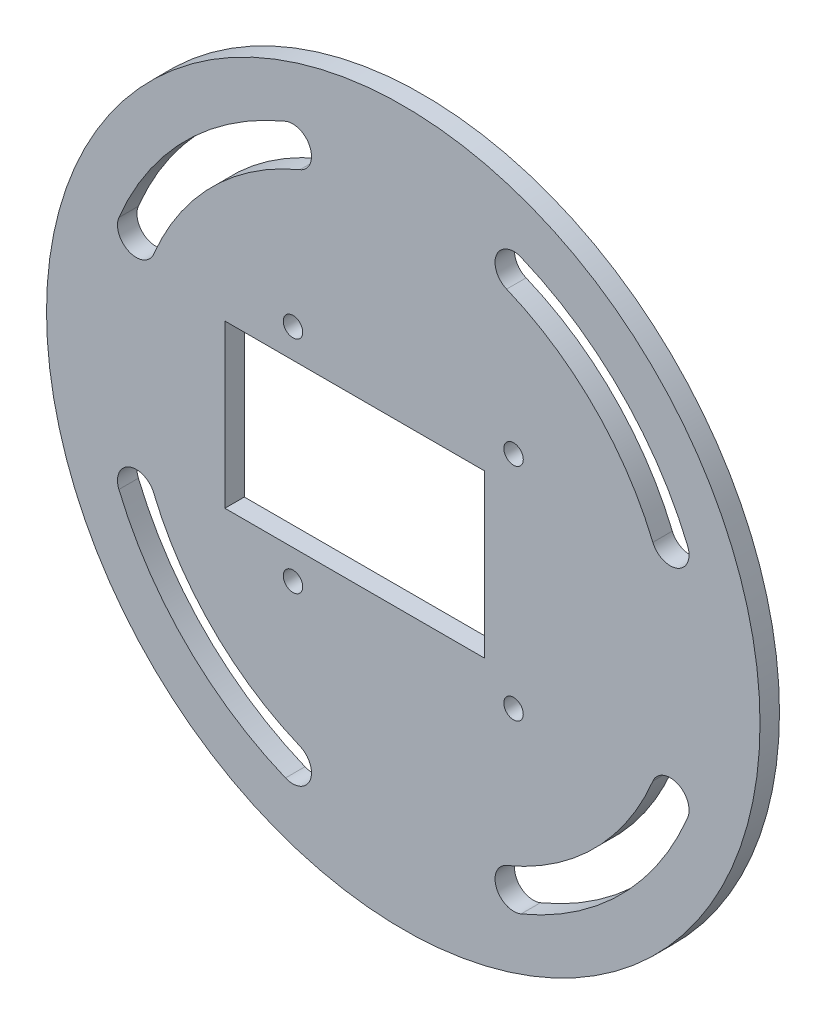
ISO-10303-21;
HEADER;
FILE_DESCRIPTION(('STEP AP214'),'2;1');
FILE_NAME('part.step','',(''),(''),'','','');
FILE_SCHEMA(('AUTOMOTIVE_DESIGN { 1 0 10303 214 1 1 1 1 }'));
ENDSEC;
DATA;
#1=APPLICATION_CONTEXT('core data for automotive mechanical design processes');
#2=APPLICATION_PROTOCOL_DEFINITION('international standard','automotive_design',2000,#1);
#3=PRODUCT_CONTEXT('',#1,'mechanical');
#4=PRODUCT('Part','Part','',(#3));
#5=PRODUCT_RELATED_PRODUCT_CATEGORY('part','',(#4));
#6=PRODUCT_DEFINITION_FORMATION('','',#4);
#7=PRODUCT_DEFINITION_CONTEXT('part definition',#1,'design');
#8=PRODUCT_DEFINITION('design','',#6,#7);
#9=PRODUCT_DEFINITION_SHAPE('','',#8);
#10=(LENGTH_UNIT() NAMED_UNIT(*) SI_UNIT(.MILLI.,.METRE.));
#11=(NAMED_UNIT(*) PLANE_ANGLE_UNIT() SI_UNIT($,.RADIAN.));
#12=(NAMED_UNIT(*) SI_UNIT($,.STERADIAN.) SOLID_ANGLE_UNIT());
#13=UNCERTAINTY_MEASURE_WITH_UNIT(LENGTH_MEASURE(1.E-05),#10,'distance_accuracy_value','');
#14=(GEOMETRIC_REPRESENTATION_CONTEXT(3) GLOBAL_UNCERTAINTY_ASSIGNED_CONTEXT((#13)) GLOBAL_UNIT_ASSIGNED_CONTEXT((#10,
#11,#12)) REPRESENTATION_CONTEXT('',''));
#15=CARTESIAN_POINT('',(0.,0.,0.));
#16=DIRECTION('',(0.,0.,1.));
#17=DIRECTION('',(1.,0.,0.));
#18=AXIS2_PLACEMENT_3D('',#15,#16,#17);
#19=CARTESIAN_POINT('',(0.,0.,3.));
#20=DIRECTION('',(0.,0.,-1.));
#21=DIRECTION('',(-1.,0.,0.));
#22=AXIS2_PLACEMENT_3D('',#19,#20,#21);
#23=CYLINDRICAL_SURFACE('',#22,55.);
#24=CARTESIAN_POINT('',(0.,0.,3.));
#25=DIRECTION('',(0.,0.,1.));
#26=DIRECTION('',(1.,0.,0.));
#27=AXIS2_PLACEMENT_3D('',#24,#25,#26);
#28=CIRCLE('',#27,55.);
#29=CARTESIAN_POINT('',(55.,0.,3.));
#30=VERTEX_POINT('',#29);
#31=EDGE_CURVE('E11',#30,#30,#28,.T.);
#32=ORIENTED_EDGE('',*,*,#31,.F.);
#33=EDGE_LOOP('',(#32));
#34=FACE_BOUND('',#33,.T.);
#35=CARTESIAN_POINT('',(0.,0.,0.));
#36=DIRECTION('',(0.,0.,1.));
#37=DIRECTION('',(1.,0.,0.));
#38=AXIS2_PLACEMENT_3D('',#35,#36,#37);
#39=CIRCLE('',#38,55.);
#40=CARTESIAN_POINT('',(55.,0.,0.));
#41=VERTEX_POINT('',#40);
#42=EDGE_CURVE('E43',#41,#41,#39,.T.);
#43=ORIENTED_EDGE('',*,*,#42,.T.);
#44=EDGE_LOOP('',(#43));
#45=FACE_BOUND('',#44,.T.);
#46=ADVANCED_FACE('F40',(#34,#45),#23,.T.);
#47=CARTESIAN_POINT('',(0.,0.,3.));
#48=DIRECTION('',(0.,0.,1.));
#49=DIRECTION('',(1.,0.,0.));
#50=AXIS2_PLACEMENT_3D('',#47,#48,#49);
#51=PLANE('',#50);
#52=CARTESIAN_POINT('',(-16.9999999999996,-17.,3.));
#53=DIRECTION('',(0.,0.,1.));
#54=DIRECTION('',(1.,0.,0.));
#55=AXIS2_PLACEMENT_3D('',#52,#53,#54);
#56=CIRCLE('',#55,1.5);
#57=CARTESIAN_POINT('',(-15.4999999999996,-17.,3.));
#58=VERTEX_POINT('',#57);
#59=EDGE_CURVE('E715',#58,#58,#56,.T.);
#60=ORIENTED_EDGE('',*,*,#59,.F.);
#61=EDGE_LOOP('',(#60));
#62=FACE_BOUND('',#61,.T.);
#63=CARTESIAN_POINT('',(17.0000000000004,-17.,3.));
#64=DIRECTION('',(0.,0.,1.));
#65=DIRECTION('',(1.,0.,0.));
#66=AXIS2_PLACEMENT_3D('',#63,#64,#65);
#67=CIRCLE('',#66,1.5);
#68=CARTESIAN_POINT('',(18.5000000000004,-17.,3.));
#69=VERTEX_POINT('',#68);
#70=EDGE_CURVE('E719',#69,#69,#67,.T.);
#71=ORIENTED_EDGE('',*,*,#70,.F.);
#72=EDGE_LOOP('',(#71));
#73=FACE_BOUND('',#72,.T.);
#74=CARTESIAN_POINT('',(17.,17.,3.));
#75=DIRECTION('',(0.,0.,1.));
#76=DIRECTION('',(1.,0.,0.));
#77=AXIS2_PLACEMENT_3D('',#74,#75,#76);
#78=CIRCLE('',#77,1.5);
#79=CARTESIAN_POINT('',(18.5,17.,3.));
#80=VERTEX_POINT('',#79);
#81=EDGE_CURVE('E727',#80,#80,#78,.T.);
#82=ORIENTED_EDGE('',*,*,#81,.F.);
#83=EDGE_LOOP('',(#82));
#84=FACE_BOUND('',#83,.T.);
#85=CARTESIAN_POINT('',(-17.,17.,3.));
#86=DIRECTION('',(0.,0.,1.));
#87=DIRECTION('',(1.,0.,0.));
#88=AXIS2_PLACEMENT_3D('',#85,#86,#87);
#89=CIRCLE('',#88,1.5);
#90=CARTESIAN_POINT('',(-15.5,17.,3.));
#91=VERTEX_POINT('',#90);
#92=EDGE_CURVE('E206',#91,#91,#89,.T.);
#93=ORIENTED_EDGE('',*,*,#92,.F.);
#94=EDGE_LOOP('',(#93));
#95=FACE_BOUND('',#94,.T.);
#96=DIRECTION('',(0.,1.,0.));
#97=VECTOR('',#96,1.);
#98=CARTESIAN_POINT('',(12.5,-12.5,3.));
#99=LINE('',#98,#97);
#100=CARTESIAN_POINT('',(12.5,-12.5,3.));
#101=VERTEX_POINT('',#100);
#102=CARTESIAN_POINT('',(12.5,12.5,3.));
#103=VERTEX_POINT('',#102);
#104=EDGE_CURVE('E54',#101,#103,#99,.T.);
#105=ORIENTED_EDGE('',*,*,#104,.F.);
#106=DIRECTION('',(1.,0.,0.));
#107=VECTOR('',#106,1.);
#108=CARTESIAN_POINT('',(12.5,-12.5,3.));
#109=LINE('',#108,#107);
#110=CARTESIAN_POINT('',(-27.5,-12.5,3.));
#111=VERTEX_POINT('',#110);
#112=EDGE_CURVE('E208',#111,#101,#109,.T.);
#113=ORIENTED_EDGE('',*,*,#112,.F.);
#114=DIRECTION('',(0.,-1.,0.));
#115=VECTOR('',#114,1.);
#116=CARTESIAN_POINT('',(-27.5,12.5,3.));
#117=LINE('',#116,#115);
#118=CARTESIAN_POINT('',(-27.5,12.5,3.));
#119=VERTEX_POINT('',#118);
#120=EDGE_CURVE('E178',#119,#111,#117,.T.);
#121=ORIENTED_EDGE('',*,*,#120,.F.);
#122=DIRECTION('',(-1.,0.,0.));
#123=VECTOR('',#122,1.);
#124=CARTESIAN_POINT('',(-12.5,12.5,3.));
#125=LINE('',#124,#123);
#126=EDGE_CURVE('E203',#103,#119,#125,.T.);
#127=ORIENTED_EDGE('',*,*,#126,.F.);
#128=EDGE_LOOP('',(#105,#113,#121,#127));
#129=FACE_BOUND('',#128,.T.);
#130=CARTESIAN_POINT('',(0.,0.,3.));
#131=DIRECTION('',(0.,0.,-1.));
#132=DIRECTION('',(1.,0.,0.));
#133=AXIS2_PLACEMENT_3D('',#130,#131,#132);
#134=CIRCLE('',#133,41.6477272147537);
#135=CARTESIAN_POINT('',(-15.9378952007363,-38.4774827493286,3.));
#136=VERTEX_POINT('',#135);
#137=CARTESIAN_POINT('',(-38.4774827493223,-15.9378952007516,3.));
#138=VERTEX_POINT('',#137);
#139=EDGE_CURVE('E260',#136,#138,#134,.T.);
#140=ORIENTED_EDGE('',*,*,#139,.F.);
#141=CARTESIAN_POINT('',(-17.0476771545952,-41.1567333936137,3.));
#142=DIRECTION('',(0.,0.,1.));
#143=DIRECTION('',(1.,0.,0.));
#144=AXIS2_PLACEMENT_3D('',#141,#142,#143);
#145=CIRCLE('',#144,2.90000000000222);
#146=CARTESIAN_POINT('',(-18.157459108454,-43.8359840378988,3.));
#147=VERTEX_POINT('',#146);
#148=EDGE_CURVE('E291',#147,#136,#145,.T.);
#149=ORIENTED_EDGE('',*,*,#148,.F.);
#150=CARTESIAN_POINT('',(0.,0.,3.));
#151=DIRECTION('',(0.,0.,1.));
#152=DIRECTION('',(1.,0.,0.));
#153=AXIS2_PLACEMENT_3D('',#150,#151,#152);
#154=CIRCLE('',#153,47.4477272147581);
#155=CARTESIAN_POINT('',(-43.8359840378916,-18.1574591084715,3.));
#156=VERTEX_POINT('',#155);
#157=EDGE_CURVE('E294',#156,#147,#154,.T.);
#158=ORIENTED_EDGE('',*,*,#157,.F.);
#159=CARTESIAN_POINT('',(-41.1567333936069,-17.0476771546116,3.));
#160=DIRECTION('',(0.,0.,1.));
#161=DIRECTION('',(1.,0.,0.));
#162=AXIS2_PLACEMENT_3D('',#159,#160,#161);
#163=CIRCLE('',#162,2.90000000000222);
#164=EDGE_CURVE('E298',#138,#156,#163,.T.);
#165=ORIENTED_EDGE('',*,*,#164,.F.);
#166=EDGE_LOOP('',(#140,#149,#158,#165));
#167=FACE_BOUND('',#166,.T.);
#168=CARTESIAN_POINT('',(0.,0.,3.));
#169=DIRECTION('',(0.,0.,-1.));
#170=DIRECTION('',(1.,0.,0.));
#171=AXIS2_PLACEMENT_3D('',#168,#169,#170);
#172=CIRCLE('',#171,41.6477272147537);
#173=CARTESIAN_POINT('',(38.4774827493303,-15.9378952007322,3.));
#174=VERTEX_POINT('',#173);
#175=CARTESIAN_POINT('',(15.9378952007616,-38.4774827493181,3.));
#176=VERTEX_POINT('',#175);
#177=EDGE_CURVE('E226',#174,#176,#172,.T.);
#178=ORIENTED_EDGE('',*,*,#177,.F.);
#179=CARTESIAN_POINT('',(41.1567333936093,-17.0476771546058,3.));
#180=DIRECTION('',(0.,0.,1.));
#181=DIRECTION('',(1.,0.,0.));
#182=AXIS2_PLACEMENT_3D('',#179,#180,#181);
#183=CIRCLE('',#182,2.90000000000222);
#184=CARTESIAN_POINT('',(43.8359840378941,-18.1574591084654,3.));
#185=VERTEX_POINT('',#184);
#186=EDGE_CURVE('E261',#185,#174,#183,.T.);
#187=ORIENTED_EDGE('',*,*,#186,.F.);
#188=CARTESIAN_POINT('',(0.,0.,3.));
#189=DIRECTION('',(0.,0.,1.));
#190=DIRECTION('',(1.,0.,0.));
#191=AXIS2_PLACEMENT_3D('',#188,#189,#190);
#192=CIRCLE('',#191,47.4477272147581);
#193=CARTESIAN_POINT('',(18.1574591084829,-43.8359840378868,3.));
#194=VERTEX_POINT('',#193);
#195=EDGE_CURVE('E264',#194,#185,#192,.T.);
#196=ORIENTED_EDGE('',*,*,#195,.F.);
#197=CARTESIAN_POINT('',(17.0476771546072,-41.1567333936087,3.));
#198=DIRECTION('',(0.,0.,1.));
#199=DIRECTION('',(1.,0.,0.));
#200=AXIS2_PLACEMENT_3D('',#197,#198,#199);
#201=CIRCLE('',#200,2.90000000000222);
#202=EDGE_CURVE('E268',#176,#194,#201,.T.);
#203=ORIENTED_EDGE('',*,*,#202,.F.);
#204=EDGE_LOOP('',(#178,#187,#196,#203));
#205=FACE_BOUND('',#204,.T.);
#206=CARTESIAN_POINT('',(0.,0.,3.));
#207=DIRECTION('',(0.,0.,-1.));
#208=DIRECTION('',(1.,0.,0.));
#209=AXIS2_PLACEMENT_3D('',#206,#207,#208);
#210=CIRCLE('',#209,41.6477272147537);
#211=CARTESIAN_POINT('',(15.9378952007422,38.4774827493262,3.));
#212=VERTEX_POINT('',#211);
#213=CARTESIAN_POINT('',(38.4774827493198,15.9378952007575,3.));
#214=VERTEX_POINT('',#213);
#215=EDGE_CURVE('E237',#212,#214,#210,.T.);
#216=ORIENTED_EDGE('',*,*,#215,.F.);
#217=CARTESIAN_POINT('',(17.0476771545951,41.1567333936137,3.));
#218=DIRECTION('',(0.,0.,1.));
#219=DIRECTION('',(1.,0.,0.));
#220=AXIS2_PLACEMENT_3D('',#217,#218,#219);
#221=CIRCLE('',#220,2.90000000000222);
#222=CARTESIAN_POINT('',(18.1574591084607,43.835984037896,3.));
#223=VERTEX_POINT('',#222);
#224=EDGE_CURVE('E227',#223,#212,#221,.T.);
#225=ORIENTED_EDGE('',*,*,#224,.F.);
#226=CARTESIAN_POINT('',(0.,0.,3.));
#227=DIRECTION('',(0.,0.,1.));
#228=DIRECTION('',(1.,0.,0.));
#229=AXIS2_PLACEMENT_3D('',#226,#227,#228);
#230=CIRCLE('',#229,47.4477272147581);
#231=CARTESIAN_POINT('',(43.8359840378915,18.1574591084715,3.));
#232=VERTEX_POINT('',#231);
#233=EDGE_CURVE('E230',#232,#223,#230,.T.);
#234=ORIENTED_EDGE('',*,*,#233,.F.);
#235=CARTESIAN_POINT('',(41.1567333936069,17.0476771546116,3.));
#236=DIRECTION('',(0.,0.,1.));
#237=DIRECTION('',(1.,0.,0.));
#238=AXIS2_PLACEMENT_3D('',#235,#236,#237);
#239=CIRCLE('',#238,2.90000000000222);
#240=EDGE_CURVE('E234',#214,#232,#239,.T.);
#241=ORIENTED_EDGE('',*,*,#240,.F.);
#242=EDGE_LOOP('',(#216,#225,#234,#241));
#243=FACE_BOUND('',#242,.T.);
#244=CARTESIAN_POINT('',(0.,0.,3.));
#245=DIRECTION('',(0.,0.,-1.));
#246=DIRECTION('',(1.,0.,0.));
#247=AXIS2_PLACEMENT_3D('',#244,#245,#246);
#248=CIRCLE('',#247,41.6477272147537);
#249=CARTESIAN_POINT('',(-38.4774827493245,15.9378952007463,3.));
#250=VERTEX_POINT('',#249);
#251=CARTESIAN_POINT('',(-15.9378952007475,38.477482749324,3.));
#252=VERTEX_POINT('',#251);
#253=EDGE_CURVE('E239',#250,#252,#248,.T.);
#254=ORIENTED_EDGE('',*,*,#253,.F.);
#255=CARTESIAN_POINT('',(-41.1567333936093,17.0476771546058,3.));
#256=DIRECTION('',(0.,0.,1.));
#257=DIRECTION('',(1.,0.,0.));
#258=AXIS2_PLACEMENT_3D('',#255,#256,#257);
#259=CIRCLE('',#258,2.90000000000222);
#260=CARTESIAN_POINT('',(-43.8359840378941,18.1574591084654,3.));
#261=VERTEX_POINT('',#260);
#262=EDGE_CURVE('E316',#261,#250,#259,.T.);
#263=ORIENTED_EDGE('',*,*,#262,.F.);
#264=CARTESIAN_POINT('',(0.,0.,3.));
#265=DIRECTION('',(0.,0.,1.));
#266=DIRECTION('',(1.,0.,0.));
#267=AXIS2_PLACEMENT_3D('',#264,#265,#266);
#268=CIRCLE('',#267,47.4477272147581);
#269=CARTESIAN_POINT('',(-18.1574591084668,43.8359840378935,3.));
#270=VERTEX_POINT('',#269);
#271=EDGE_CURVE('E330',#270,#261,#268,.T.);
#272=ORIENTED_EDGE('',*,*,#271,.F.);
#273=CARTESIAN_POINT('',(-17.0476771546072,41.1567333936087,3.));
#274=DIRECTION('',(0.,0.,1.));
#275=DIRECTION('',(1.,0.,0.));
#276=AXIS2_PLACEMENT_3D('',#273,#274,#275);
#277=CIRCLE('',#276,2.90000000000222);
#278=EDGE_CURVE('E327',#252,#270,#277,.T.);
#279=ORIENTED_EDGE('',*,*,#278,.F.);
#280=EDGE_LOOP('',(#254,#263,#272,#279));
#281=FACE_BOUND('',#280,.T.);
#282=ORIENTED_EDGE('',*,*,#31,.T.);
#283=EDGE_LOOP('',(#282));
#284=FACE_BOUND('',#283,.T.);
#285=ADVANCED_FACE('F352',(#62,#73,#84,#95,#129,#167,#205,#243,#281,#284),#51,.T.);
#286=CARTESIAN_POINT('',(0.,0.,0.));
#287=DIRECTION('',(0.,0.,1.));
#288=DIRECTION('',(1.,0.,0.));
#289=AXIS2_PLACEMENT_3D('',#286,#287,#288);
#290=PLANE('',#289);
#291=CARTESIAN_POINT('',(-16.9999999999996,-17.,0.));
#292=DIRECTION('',(0.,0.,1.));
#293=DIRECTION('',(1.,0.,0.));
#294=AXIS2_PLACEMENT_3D('',#291,#292,#293);
#295=CIRCLE('',#294,1.5);
#296=CARTESIAN_POINT('',(-15.4999999999996,-17.,0.));
#297=VERTEX_POINT('',#296);
#298=EDGE_CURVE('E712',#297,#297,#295,.T.);
#299=ORIENTED_EDGE('',*,*,#298,.T.);
#300=EDGE_LOOP('',(#299));
#301=FACE_BOUND('',#300,.T.);
#302=CARTESIAN_POINT('',(17.0000000000004,-17.,0.));
#303=DIRECTION('',(0.,0.,1.));
#304=DIRECTION('',(1.,0.,0.));
#305=AXIS2_PLACEMENT_3D('',#302,#303,#304);
#306=CIRCLE('',#305,1.5);
#307=CARTESIAN_POINT('',(18.5000000000004,-17.,0.));
#308=VERTEX_POINT('',#307);
#309=EDGE_CURVE('E716',#308,#308,#306,.T.);
#310=ORIENTED_EDGE('',*,*,#309,.T.);
#311=EDGE_LOOP('',(#310));
#312=FACE_BOUND('',#311,.T.);
#313=CARTESIAN_POINT('',(17.,17.,0.));
#314=DIRECTION('',(0.,0.,1.));
#315=DIRECTION('',(1.,0.,0.));
#316=AXIS2_PLACEMENT_3D('',#313,#314,#315);
#317=CIRCLE('',#316,1.5);
#318=CARTESIAN_POINT('',(18.5,17.,0.));
#319=VERTEX_POINT('',#318);
#320=EDGE_CURVE('E724',#319,#319,#317,.T.);
#321=ORIENTED_EDGE('',*,*,#320,.T.);
#322=EDGE_LOOP('',(#321));
#323=FACE_BOUND('',#322,.T.);
#324=CARTESIAN_POINT('',(-17.,17.,0.));
#325=DIRECTION('',(0.,0.,1.));
#326=DIRECTION('',(1.,0.,0.));
#327=AXIS2_PLACEMENT_3D('',#324,#325,#326);
#328=CIRCLE('',#327,1.5);
#329=CARTESIAN_POINT('',(-15.5,17.,0.));
#330=VERTEX_POINT('',#329);
#331=EDGE_CURVE('E730',#330,#330,#328,.T.);
#332=ORIENTED_EDGE('',*,*,#331,.T.);
#333=EDGE_LOOP('',(#332));
#334=FACE_BOUND('',#333,.T.);
#335=DIRECTION('',(1.,0.,0.));
#336=VECTOR('',#335,1.);
#337=CARTESIAN_POINT('',(-27.5,-12.5,0.));
#338=LINE('',#337,#336);
#339=CARTESIAN_POINT('',(-27.5,-12.5,0.));
#340=VERTEX_POINT('',#339);
#341=CARTESIAN_POINT('',(12.5,-12.5,0.));
#342=VERTEX_POINT('',#341);
#343=EDGE_CURVE('E186',#340,#342,#338,.T.);
#344=ORIENTED_EDGE('',*,*,#343,.T.);
#345=DIRECTION('',(0.,1.,0.));
#346=VECTOR('',#345,1.);
#347=CARTESIAN_POINT('',(12.5,-12.5,0.));
#348=LINE('',#347,#346);
#349=CARTESIAN_POINT('',(12.5,12.5,0.));
#350=VERTEX_POINT('',#349);
#351=EDGE_CURVE('E191',#342,#350,#348,.T.);
#352=ORIENTED_EDGE('',*,*,#351,.T.);
#353=DIRECTION('',(-1.,0.,0.));
#354=VECTOR('',#353,1.);
#355=CARTESIAN_POINT('',(12.5,12.5,0.));
#356=LINE('',#355,#354);
#357=CARTESIAN_POINT('',(-27.5,12.5,0.));
#358=VERTEX_POINT('',#357);
#359=EDGE_CURVE('E197',#350,#358,#356,.T.);
#360=ORIENTED_EDGE('',*,*,#359,.T.);
#361=DIRECTION('',(0.,-1.,0.));
#362=VECTOR('',#361,1.);
#363=CARTESIAN_POINT('',(-27.5,12.5,0.));
#364=LINE('',#363,#362);
#365=EDGE_CURVE('E62',#358,#340,#364,.T.);
#366=ORIENTED_EDGE('',*,*,#365,.T.);
#367=EDGE_LOOP('',(#344,#352,#360,#366));
#368=FACE_BOUND('',#367,.T.);
#369=CARTESIAN_POINT('',(-17.0476771545952,-41.1567333936137,0.));
#370=DIRECTION('',(0.,0.,1.));
#371=DIRECTION('',(1.,0.,0.));
#372=AXIS2_PLACEMENT_3D('',#369,#370,#371);
#373=CIRCLE('',#372,2.90000000000222);
#374=CARTESIAN_POINT('',(-18.157459108454,-43.8359840378988,0.));
#375=VERTEX_POINT('',#374);
#376=CARTESIAN_POINT('',(-15.9378952007363,-38.4774827493286,0.));
#377=VERTEX_POINT('',#376);
#378=EDGE_CURVE('E285',#375,#377,#373,.T.);
#379=ORIENTED_EDGE('',*,*,#378,.T.);
#380=CARTESIAN_POINT('',(0.,0.,0.));
#381=DIRECTION('',(0.,0.,-1.));
#382=DIRECTION('',(1.,0.,0.));
#383=AXIS2_PLACEMENT_3D('',#380,#381,#382);
#384=CIRCLE('',#383,41.6477272147537);
#385=CARTESIAN_POINT('',(-38.4774827493223,-15.9378952007516,0.));
#386=VERTEX_POINT('',#385);
#387=EDGE_CURVE('E295',#377,#386,#384,.T.);
#388=ORIENTED_EDGE('',*,*,#387,.T.);
#389=CARTESIAN_POINT('',(-41.1567333936069,-17.0476771546116,0.));
#390=DIRECTION('',(0.,0.,1.));
#391=DIRECTION('',(1.,0.,0.));
#392=AXIS2_PLACEMENT_3D('',#389,#390,#391);
#393=CIRCLE('',#392,2.90000000000222);
#394=CARTESIAN_POINT('',(-43.8359840378916,-18.1574591084715,0.));
#395=VERTEX_POINT('',#394);
#396=EDGE_CURVE('E307',#386,#395,#393,.T.);
#397=ORIENTED_EDGE('',*,*,#396,.T.);
#398=CARTESIAN_POINT('',(0.,0.,0.));
#399=DIRECTION('',(0.,0.,1.));
#400=DIRECTION('',(1.,0.,0.));
#401=AXIS2_PLACEMENT_3D('',#398,#399,#400);
#402=CIRCLE('',#401,47.4477272147581);
#403=EDGE_CURVE('E304',#395,#375,#402,.T.);
#404=ORIENTED_EDGE('',*,*,#403,.T.);
#405=EDGE_LOOP('',(#379,#388,#397,#404));
#406=FACE_BOUND('',#405,.T.);
#407=CARTESIAN_POINT('',(41.1567333936093,-17.0476771546058,0.));
#408=DIRECTION('',(0.,0.,1.));
#409=DIRECTION('',(1.,0.,0.));
#410=AXIS2_PLACEMENT_3D('',#407,#408,#409);
#411=CIRCLE('',#410,2.90000000000222);
#412=CARTESIAN_POINT('',(43.8359840378941,-18.1574591084654,0.));
#413=VERTEX_POINT('',#412);
#414=CARTESIAN_POINT('',(38.4774827493303,-15.9378952007322,0.));
#415=VERTEX_POINT('',#414);
#416=EDGE_CURVE('E253',#413,#415,#411,.T.);
#417=ORIENTED_EDGE('',*,*,#416,.T.);
#418=CARTESIAN_POINT('',(0.,0.,0.));
#419=DIRECTION('',(0.,0.,-1.));
#420=DIRECTION('',(1.,0.,0.));
#421=AXIS2_PLACEMENT_3D('',#418,#419,#420);
#422=CIRCLE('',#421,41.6477272147537);
#423=CARTESIAN_POINT('',(15.9378952007616,-38.4774827493181,0.));
#424=VERTEX_POINT('',#423);
#425=EDGE_CURVE('E265',#415,#424,#422,.T.);
#426=ORIENTED_EDGE('',*,*,#425,.T.);
#427=CARTESIAN_POINT('',(17.0476771546072,-41.1567333936087,0.));
#428=DIRECTION('',(0.,0.,1.));
#429=DIRECTION('',(1.,0.,0.));
#430=AXIS2_PLACEMENT_3D('',#427,#428,#429);
#431=CIRCLE('',#430,2.90000000000222);
#432=CARTESIAN_POINT('',(18.1574591084829,-43.8359840378868,0.));
#433=VERTEX_POINT('',#432);
#434=EDGE_CURVE('E277',#424,#433,#431,.T.);
#435=ORIENTED_EDGE('',*,*,#434,.T.);
#436=CARTESIAN_POINT('',(0.,0.,0.));
#437=DIRECTION('',(0.,0.,1.));
#438=DIRECTION('',(1.,0.,0.));
#439=AXIS2_PLACEMENT_3D('',#436,#437,#438);
#440=CIRCLE('',#439,47.4477272147581);
#441=EDGE_CURVE('E274',#433,#413,#440,.T.);
#442=ORIENTED_EDGE('',*,*,#441,.T.);
#443=EDGE_LOOP('',(#417,#426,#435,#442));
#444=FACE_BOUND('',#443,.T.);
#445=CARTESIAN_POINT('',(17.0476771545951,41.1567333936137,0.));
#446=DIRECTION('',(0.,0.,1.));
#447=DIRECTION('',(1.,0.,0.));
#448=AXIS2_PLACEMENT_3D('',#445,#446,#447);
#449=CIRCLE('',#448,2.90000000000222);
#450=CARTESIAN_POINT('',(18.1574591084607,43.835984037896,0.));
#451=VERTEX_POINT('',#450);
#452=CARTESIAN_POINT('',(15.9378952007422,38.4774827493262,0.));
#453=VERTEX_POINT('',#452);
#454=EDGE_CURVE('E219',#451,#453,#449,.T.);
#455=ORIENTED_EDGE('',*,*,#454,.T.);
#456=CARTESIAN_POINT('',(0.,0.,0.));
#457=DIRECTION('',(0.,0.,-1.));
#458=DIRECTION('',(1.,0.,0.));
#459=AXIS2_PLACEMENT_3D('',#456,#457,#458);
#460=CIRCLE('',#459,41.6477272147537);
#461=CARTESIAN_POINT('',(38.4774827493198,15.9378952007575,0.));
#462=VERTEX_POINT('',#461);
#463=EDGE_CURVE('E231',#453,#462,#460,.T.);
#464=ORIENTED_EDGE('',*,*,#463,.T.);
#465=CARTESIAN_POINT('',(41.1567333936069,17.0476771546116,0.));
#466=DIRECTION('',(0.,0.,1.));
#467=DIRECTION('',(1.,0.,0.));
#468=AXIS2_PLACEMENT_3D('',#465,#466,#467);
#469=CIRCLE('',#468,2.90000000000222);
#470=CARTESIAN_POINT('',(43.8359840378916,18.1574591084715,0.));
#471=VERTEX_POINT('',#470);
#472=EDGE_CURVE('E245',#462,#471,#469,.T.);
#473=ORIENTED_EDGE('',*,*,#472,.T.);
#474=CARTESIAN_POINT('',(0.,0.,0.));
#475=DIRECTION('',(0.,0.,1.));
#476=DIRECTION('',(1.,0.,0.));
#477=AXIS2_PLACEMENT_3D('',#474,#475,#476);
#478=CIRCLE('',#477,47.4477272147581);
#479=EDGE_CURVE('E242',#471,#451,#478,.T.);
#480=ORIENTED_EDGE('',*,*,#479,.T.);
#481=EDGE_LOOP('',(#455,#464,#473,#480));
#482=FACE_BOUND('',#481,.T.);
#483=CARTESIAN_POINT('',(-41.1567333936093,17.0476771546058,0.));
#484=DIRECTION('',(0.,0.,1.));
#485=DIRECTION('',(1.,0.,0.));
#486=AXIS2_PLACEMENT_3D('',#483,#484,#485);
#487=CIRCLE('',#486,2.90000000000222);
#488=CARTESIAN_POINT('',(-43.8359840378941,18.1574591084654,0.));
#489=VERTEX_POINT('',#488);
#490=CARTESIAN_POINT('',(-38.4774827493245,15.9378952007463,0.));
#491=VERTEX_POINT('',#490);
#492=EDGE_CURVE('E322',#489,#491,#487,.T.);
#493=ORIENTED_EDGE('',*,*,#492,.T.);
#494=CARTESIAN_POINT('',(0.,0.,0.));
#495=DIRECTION('',(0.,0.,-1.));
#496=DIRECTION('',(1.,0.,0.));
#497=AXIS2_PLACEMENT_3D('',#494,#495,#496);
#498=CIRCLE('',#497,41.6477272147537);
#499=CARTESIAN_POINT('',(-15.9378952007475,38.477482749324,0.));
#500=VERTEX_POINT('',#499);
#501=EDGE_CURVE('E312',#491,#500,#498,.T.);
#502=ORIENTED_EDGE('',*,*,#501,.T.);
#503=CARTESIAN_POINT('',(-17.0476771546072,41.1567333936087,0.));
#504=DIRECTION('',(0.,0.,1.));
#505=DIRECTION('',(1.,0.,0.));
#506=AXIS2_PLACEMENT_3D('',#503,#504,#505);
#507=CIRCLE('',#506,2.90000000000222);
#508=CARTESIAN_POINT('',(-18.1574591084668,43.8359840378935,0.));
#509=VERTEX_POINT('',#508);
#510=EDGE_CURVE('E315',#500,#509,#507,.T.);
#511=ORIENTED_EDGE('',*,*,#510,.T.);
#512=CARTESIAN_POINT('',(0.,0.,0.));
#513=DIRECTION('',(0.,0.,1.));
#514=DIRECTION('',(1.,0.,0.));
#515=AXIS2_PLACEMENT_3D('',#512,#513,#514);
#516=CIRCLE('',#515,47.4477272147581);
#517=EDGE_CURVE('E319',#509,#489,#516,.T.);
#518=ORIENTED_EDGE('',*,*,#517,.T.);
#519=EDGE_LOOP('',(#493,#502,#511,#518));
#520=FACE_BOUND('',#519,.T.);
#521=ORIENTED_EDGE('',*,*,#42,.F.);
#522=EDGE_LOOP('',(#521));
#523=FACE_BOUND('',#522,.T.);
#524=ADVANCED_FACE('F194',(#301,#312,#323,#334,#368,#406,#444,#482,#520,#523),#290,.F.);
#525=CARTESIAN_POINT('',(0.,0.,0.));
#526=DIRECTION('',(0.,0.,1.));
#527=DIRECTION('',(1.,0.,0.));
#528=AXIS2_PLACEMENT_3D('',#525,#526,#527);
#529=CYLINDRICAL_SURFACE('',#528,41.6477272147537);
#530=ORIENTED_EDGE('',*,*,#253,.T.);
#531=DIRECTION('',(0.,0.,1.));
#532=VECTOR('',#531,1.);
#533=CARTESIAN_POINT('',(-15.9378952007475,38.477482749324,0.));
#534=LINE('',#533,#532);
#535=EDGE_CURVE('E325',#500,#252,#534,.T.);
#536=ORIENTED_EDGE('',*,*,#535,.F.);
#537=ORIENTED_EDGE('',*,*,#501,.F.);
#538=DIRECTION('',(0.,0.,1.));
#539=VECTOR('',#538,1.);
#540=CARTESIAN_POINT('',(-38.4774827493245,15.9378952007463,0.));
#541=LINE('',#540,#539);
#542=EDGE_CURVE('E335',#491,#250,#541,.T.);
#543=ORIENTED_EDGE('',*,*,#542,.T.);
#544=EDGE_LOOP('',(#530,#536,#537,#543));
#545=FACE_BOUND('',#544,.T.);
#546=ADVANCED_FACE('F360',(#545),#529,.T.);
#547=CARTESIAN_POINT('',(-41.1567333936093,17.0476771546058,0.));
#548=DIRECTION('',(0.,0.,1.));
#549=DIRECTION('',(1.,0.,0.));
#550=AXIS2_PLACEMENT_3D('',#547,#548,#549);
#551=CYLINDRICAL_SURFACE('',#550,2.90000000000222);
#552=ORIENTED_EDGE('',*,*,#262,.T.);
#553=ORIENTED_EDGE('',*,*,#542,.F.);
#554=ORIENTED_EDGE('',*,*,#492,.F.);
#555=DIRECTION('',(0.,0.,1.));
#556=VECTOR('',#555,1.);
#557=CARTESIAN_POINT('',(-43.8359840378941,18.1574591084654,0.));
#558=LINE('',#557,#556);
#559=EDGE_CURVE('E337',#489,#261,#558,.T.);
#560=ORIENTED_EDGE('',*,*,#559,.T.);
#561=EDGE_LOOP('',(#552,#553,#554,#560));
#562=FACE_BOUND('',#561,.T.);
#563=ADVANCED_FACE('F362',(#562),#551,.F.);
#564=CARTESIAN_POINT('',(0.,0.,0.));
#565=DIRECTION('',(0.,0.,1.));
#566=DIRECTION('',(1.,0.,0.));
#567=AXIS2_PLACEMENT_3D('',#564,#565,#566);
#568=CYLINDRICAL_SURFACE('',#567,47.4477272147581);
#569=ORIENTED_EDGE('',*,*,#271,.T.);
#570=ORIENTED_EDGE('',*,*,#559,.F.);
#571=ORIENTED_EDGE('',*,*,#517,.F.);
#572=DIRECTION('',(0.,0.,1.));
#573=VECTOR('',#572,1.);
#574=CARTESIAN_POINT('',(-18.1574591084668,43.8359840378935,0.));
#575=LINE('',#574,#573);
#576=EDGE_CURVE('E339',#509,#270,#575,.T.);
#577=ORIENTED_EDGE('',*,*,#576,.T.);
#578=EDGE_LOOP('',(#569,#570,#571,#577));
#579=FACE_BOUND('',#578,.T.);
#580=ADVANCED_FACE('F356',(#579),#568,.F.);
#581=CARTESIAN_POINT('',(-17.0476771546072,41.1567333936087,0.));
#582=DIRECTION('',(0.,0.,1.));
#583=DIRECTION('',(1.,0.,0.));
#584=AXIS2_PLACEMENT_3D('',#581,#582,#583);
#585=CYLINDRICAL_SURFACE('',#584,2.90000000000222);
#586=ORIENTED_EDGE('',*,*,#278,.T.);
#587=ORIENTED_EDGE('',*,*,#576,.F.);
#588=ORIENTED_EDGE('',*,*,#510,.F.);
#589=ORIENTED_EDGE('',*,*,#535,.T.);
#590=EDGE_LOOP('',(#586,#587,#588,#589));
#591=FACE_BOUND('',#590,.T.);
#592=ADVANCED_FACE('F345',(#591),#585,.F.);
#593=CARTESIAN_POINT('',(0.,0.,0.));
#594=DIRECTION('',(0.,0.,1.));
#595=DIRECTION('',(1.,0.,0.));
#596=AXIS2_PLACEMENT_3D('',#593,#594,#595);
#597=CYLINDRICAL_SURFACE('',#596,41.6477272147537);
#598=ORIENTED_EDGE('',*,*,#215,.T.);
#599=DIRECTION('',(0.,0.,1.));
#600=VECTOR('',#599,1.);
#601=CARTESIAN_POINT('',(38.4774827493198,15.9378952007575,0.));
#602=LINE('',#601,#600);
#603=EDGE_CURVE('E216',#462,#214,#602,.T.);
#604=ORIENTED_EDGE('',*,*,#603,.F.);
#605=ORIENTED_EDGE('',*,*,#463,.F.);
#606=DIRECTION('',(0.,0.,1.));
#607=VECTOR('',#606,1.);
#608=CARTESIAN_POINT('',(15.9378952007422,38.4774827493262,0.));
#609=LINE('',#608,#607);
#610=EDGE_CURVE('E224',#453,#212,#609,.T.);
#611=ORIENTED_EDGE('',*,*,#610,.T.);
#612=EDGE_LOOP('',(#598,#604,#605,#611));
#613=FACE_BOUND('',#612,.T.);
#614=ADVANCED_FACE('F391',(#613),#597,.T.);
#615=CARTESIAN_POINT('',(17.0476771545951,41.1567333936137,0.));
#616=DIRECTION('',(0.,0.,1.));
#617=DIRECTION('',(1.,0.,0.));
#618=AXIS2_PLACEMENT_3D('',#615,#616,#617);
#619=CYLINDRICAL_SURFACE('',#618,2.90000000000222);
#620=ORIENTED_EDGE('',*,*,#224,.T.);
#621=ORIENTED_EDGE('',*,*,#610,.F.);
#622=ORIENTED_EDGE('',*,*,#454,.F.);
#623=DIRECTION('',(0.,0.,1.));
#624=VECTOR('',#623,1.);
#625=CARTESIAN_POINT('',(18.1574591084607,43.835984037896,0.));
#626=LINE('',#625,#624);
#627=EDGE_CURVE('E222',#451,#223,#626,.T.);
#628=ORIENTED_EDGE('',*,*,#627,.T.);
#629=EDGE_LOOP('',(#620,#621,#622,#628));
#630=FACE_BOUND('',#629,.T.);
#631=ADVANCED_FACE('F395',(#630),#619,.F.);
#632=CARTESIAN_POINT('',(0.,0.,0.));
#633=DIRECTION('',(0.,0.,1.));
#634=DIRECTION('',(1.,0.,0.));
#635=AXIS2_PLACEMENT_3D('',#632,#633,#634);
#636=CYLINDRICAL_SURFACE('',#635,47.4477272147581);
#637=ORIENTED_EDGE('',*,*,#233,.T.);
#638=ORIENTED_EDGE('',*,*,#627,.F.);
#639=ORIENTED_EDGE('',*,*,#479,.F.);
#640=DIRECTION('',(0.,0.,1.));
#641=VECTOR('',#640,1.);
#642=CARTESIAN_POINT('',(43.8359840378915,18.1574591084715,0.));
#643=LINE('',#642,#641);
#644=EDGE_CURVE('E220',#471,#232,#643,.T.);
#645=ORIENTED_EDGE('',*,*,#644,.T.);
#646=EDGE_LOOP('',(#637,#638,#639,#645));
#647=FACE_BOUND('',#646,.T.);
#648=ADVANCED_FACE('F401',(#647),#636,.F.);
#649=CARTESIAN_POINT('',(41.1567333936069,17.0476771546116,0.));
#650=DIRECTION('',(0.,0.,1.));
#651=DIRECTION('',(1.,0.,0.));
#652=AXIS2_PLACEMENT_3D('',#649,#650,#651);
#653=CYLINDRICAL_SURFACE('',#652,2.90000000000222);
#654=ORIENTED_EDGE('',*,*,#240,.T.);
#655=ORIENTED_EDGE('',*,*,#644,.F.);
#656=ORIENTED_EDGE('',*,*,#472,.F.);
#657=ORIENTED_EDGE('',*,*,#603,.T.);
#658=EDGE_LOOP('',(#654,#655,#656,#657));
#659=FACE_BOUND('',#658,.T.);
#660=ADVANCED_FACE('F408',(#659),#653,.F.);
#661=CARTESIAN_POINT('',(0.,0.,0.));
#662=DIRECTION('',(0.,0.,1.));
#663=DIRECTION('',(1.,0.,0.));
#664=AXIS2_PLACEMENT_3D('',#661,#662,#663);
#665=CYLINDRICAL_SURFACE('',#664,41.6477272147537);
#666=ORIENTED_EDGE('',*,*,#177,.T.);
#667=DIRECTION('',(0.,0.,1.));
#668=VECTOR('',#667,1.);
#669=CARTESIAN_POINT('',(15.9378952007616,-38.4774827493181,0.));
#670=LINE('',#669,#668);
#671=EDGE_CURVE('E250',#424,#176,#670,.T.);
#672=ORIENTED_EDGE('',*,*,#671,.F.);
#673=ORIENTED_EDGE('',*,*,#425,.F.);
#674=DIRECTION('',(0.,0.,1.));
#675=VECTOR('',#674,1.);
#676=CARTESIAN_POINT('',(38.4774827493303,-15.9378952007322,0.));
#677=LINE('',#676,#675);
#678=EDGE_CURVE('E258',#415,#174,#677,.T.);
#679=ORIENTED_EDGE('',*,*,#678,.T.);
#680=EDGE_LOOP('',(#666,#672,#673,#679));
#681=FACE_BOUND('',#680,.T.);
#682=ADVANCED_FACE('F411',(#681),#665,.T.);
#683=CARTESIAN_POINT('',(41.1567333936093,-17.0476771546058,0.));
#684=DIRECTION('',(0.,0.,1.));
#685=DIRECTION('',(1.,0.,0.));
#686=AXIS2_PLACEMENT_3D('',#683,#684,#685);
#687=CYLINDRICAL_SURFACE('',#686,2.90000000000222);
#688=ORIENTED_EDGE('',*,*,#186,.T.);
#689=ORIENTED_EDGE('',*,*,#678,.F.);
#690=ORIENTED_EDGE('',*,*,#416,.F.);
#691=DIRECTION('',(0.,0.,1.));
#692=VECTOR('',#691,1.);
#693=CARTESIAN_POINT('',(43.8359840378941,-18.1574591084654,0.));
#694=LINE('',#693,#692);
#695=EDGE_CURVE('E256',#413,#185,#694,.T.);
#696=ORIENTED_EDGE('',*,*,#695,.T.);
#697=EDGE_LOOP('',(#688,#689,#690,#696));
#698=FACE_BOUND('',#697,.T.);
#699=ADVANCED_FACE('F418',(#698),#687,.F.);
#700=CARTESIAN_POINT('',(0.,0.,0.));
#701=DIRECTION('',(0.,0.,1.));
#702=DIRECTION('',(1.,0.,0.));
#703=AXIS2_PLACEMENT_3D('',#700,#701,#702);
#704=CYLINDRICAL_SURFACE('',#703,47.4477272147581);
#705=ORIENTED_EDGE('',*,*,#195,.T.);
#706=ORIENTED_EDGE('',*,*,#695,.F.);
#707=ORIENTED_EDGE('',*,*,#441,.F.);
#708=DIRECTION('',(0.,0.,1.));
#709=VECTOR('',#708,1.);
#710=CARTESIAN_POINT('',(18.1574591084829,-43.8359840378868,0.));
#711=LINE('',#710,#709);
#712=EDGE_CURVE('E254',#433,#194,#711,.T.);
#713=ORIENTED_EDGE('',*,*,#712,.T.);
#714=EDGE_LOOP('',(#705,#706,#707,#713));
#715=FACE_BOUND('',#714,.T.);
#716=ADVANCED_FACE('F424',(#715),#704,.F.);
#717=CARTESIAN_POINT('',(17.0476771546072,-41.1567333936087,0.));
#718=DIRECTION('',(0.,0.,1.));
#719=DIRECTION('',(1.,0.,0.));
#720=AXIS2_PLACEMENT_3D('',#717,#718,#719);
#721=CYLINDRICAL_SURFACE('',#720,2.90000000000222);
#722=ORIENTED_EDGE('',*,*,#202,.T.);
#723=ORIENTED_EDGE('',*,*,#712,.F.);
#724=ORIENTED_EDGE('',*,*,#434,.F.);
#725=ORIENTED_EDGE('',*,*,#671,.T.);
#726=EDGE_LOOP('',(#722,#723,#724,#725));
#727=FACE_BOUND('',#726,.T.);
#728=ADVANCED_FACE('F420',(#727),#721,.F.);
#729=CARTESIAN_POINT('',(0.,0.,0.));
#730=DIRECTION('',(0.,0.,1.));
#731=DIRECTION('',(1.,0.,0.));
#732=AXIS2_PLACEMENT_3D('',#729,#730,#731);
#733=CYLINDRICAL_SURFACE('',#732,41.6477272147537);
#734=ORIENTED_EDGE('',*,*,#139,.T.);
#735=DIRECTION('',(0.,0.,1.));
#736=VECTOR('',#735,1.);
#737=CARTESIAN_POINT('',(-38.4774827493223,-15.9378952007516,0.));
#738=LINE('',#737,#736);
#739=EDGE_CURVE('E282',#386,#138,#738,.T.);
#740=ORIENTED_EDGE('',*,*,#739,.F.);
#741=ORIENTED_EDGE('',*,*,#387,.F.);
#742=DIRECTION('',(0.,0.,1.));
#743=VECTOR('',#742,1.);
#744=CARTESIAN_POINT('',(-15.9378952007363,-38.4774827493286,0.));
#745=LINE('',#744,#743);
#746=EDGE_CURVE('E213',#377,#136,#745,.T.);
#747=ORIENTED_EDGE('',*,*,#746,.T.);
#748=EDGE_LOOP('',(#734,#740,#741,#747));
#749=FACE_BOUND('',#748,.T.);
#750=ADVANCED_FACE('F423',(#749),#733,.T.);
#751=CARTESIAN_POINT('',(-17.0476771545952,-41.1567333936137,0.));
#752=DIRECTION('',(0.,0.,1.));
#753=DIRECTION('',(1.,0.,0.));
#754=AXIS2_PLACEMENT_3D('',#751,#752,#753);
#755=CYLINDRICAL_SURFACE('',#754,2.90000000000222);
#756=ORIENTED_EDGE('',*,*,#148,.T.);
#757=ORIENTED_EDGE('',*,*,#746,.F.);
#758=ORIENTED_EDGE('',*,*,#378,.F.);
#759=DIRECTION('',(0.,0.,1.));
#760=VECTOR('',#759,1.);
#761=CARTESIAN_POINT('',(-18.157459108454,-43.8359840378988,0.));
#762=LINE('',#761,#760);
#763=EDGE_CURVE('E288',#375,#147,#762,.T.);
#764=ORIENTED_EDGE('',*,*,#763,.T.);
#765=EDGE_LOOP('',(#756,#757,#758,#764));
#766=FACE_BOUND('',#765,.T.);
#767=ADVANCED_FACE('F434',(#766),#755,.F.);
#768=CARTESIAN_POINT('',(0.,0.,0.));
#769=DIRECTION('',(0.,0.,1.));
#770=DIRECTION('',(1.,0.,0.));
#771=AXIS2_PLACEMENT_3D('',#768,#769,#770);
#772=CYLINDRICAL_SURFACE('',#771,47.4477272147581);
#773=ORIENTED_EDGE('',*,*,#157,.T.);
#774=ORIENTED_EDGE('',*,*,#763,.F.);
#775=ORIENTED_EDGE('',*,*,#403,.F.);
#776=DIRECTION('',(0.,0.,1.));
#777=VECTOR('',#776,1.);
#778=CARTESIAN_POINT('',(-43.8359840378916,-18.1574591084715,0.));
#779=LINE('',#778,#777);
#780=EDGE_CURVE('E286',#395,#156,#779,.T.);
#781=ORIENTED_EDGE('',*,*,#780,.T.);
#782=EDGE_LOOP('',(#773,#774,#775,#781));
#783=FACE_BOUND('',#782,.T.);
#784=ADVANCED_FACE('F440',(#783),#772,.F.);
#785=CARTESIAN_POINT('',(-41.1567333936069,-17.0476771546116,0.));
#786=DIRECTION('',(0.,0.,1.));
#787=DIRECTION('',(1.,0.,0.));
#788=AXIS2_PLACEMENT_3D('',#785,#786,#787);
#789=CYLINDRICAL_SURFACE('',#788,2.90000000000222);
#790=ORIENTED_EDGE('',*,*,#164,.T.);
#791=ORIENTED_EDGE('',*,*,#780,.F.);
#792=ORIENTED_EDGE('',*,*,#396,.F.);
#793=ORIENTED_EDGE('',*,*,#739,.T.);
#794=EDGE_LOOP('',(#790,#791,#792,#793));
#795=FACE_BOUND('',#794,.T.);
#796=ADVANCED_FACE('F436',(#795),#789,.F.);
#797=CARTESIAN_POINT('',(12.5,-12.5,0.));
#798=DIRECTION('',(1.,0.,0.));
#799=DIRECTION('',(0.,0.,-1.));
#800=AXIS2_PLACEMENT_3D('',#797,#798,#799);
#801=PLANE('',#800);
#802=ORIENTED_EDGE('',*,*,#104,.T.);
#803=DIRECTION('',(0.,0.,1.));
#804=VECTOR('',#803,1.);
#805=CARTESIAN_POINT('',(12.5,12.5,0.));
#806=LINE('',#805,#804);
#807=EDGE_CURVE('E211',#350,#103,#806,.T.);
#808=ORIENTED_EDGE('',*,*,#807,.F.);
#809=ORIENTED_EDGE('',*,*,#351,.F.);
#810=DIRECTION('',(0.,0.,1.));
#811=VECTOR('',#810,1.);
#812=CARTESIAN_POINT('',(12.5,-12.5,0.));
#813=LINE('',#812,#811);
#814=EDGE_CURVE('E182',#342,#101,#813,.T.);
#815=ORIENTED_EDGE('',*,*,#814,.T.);
#816=EDGE_LOOP('',(#802,#808,#809,#815));
#817=FACE_BOUND('',#816,.T.);
#818=ADVANCED_FACE('F439',(#817),#801,.F.);
#819=CARTESIAN_POINT('',(12.5,-12.5,0.));
#820=DIRECTION('',(0.,-1.,0.));
#821=DIRECTION('',(1.,0.,0.));
#822=AXIS2_PLACEMENT_3D('',#819,#820,#821);
#823=PLANE('',#822);
#824=ORIENTED_EDGE('',*,*,#112,.T.);
#825=ORIENTED_EDGE('',*,*,#814,.F.);
#826=ORIENTED_EDGE('',*,*,#343,.F.);
#827=DIRECTION('',(0.,0.,1.));
#828=VECTOR('',#827,1.);
#829=CARTESIAN_POINT('',(-27.5,-12.5,0.));
#830=LINE('',#829,#828);
#831=EDGE_CURVE('E174',#340,#111,#830,.T.);
#832=ORIENTED_EDGE('',*,*,#831,.T.);
#833=EDGE_LOOP('',(#824,#825,#826,#832));
#834=FACE_BOUND('',#833,.T.);
#835=ADVANCED_FACE('F187',(#834),#823,.F.);
#836=CARTESIAN_POINT('',(-27.5,12.5,0.));
#837=DIRECTION('',(-1.,0.,0.));
#838=DIRECTION('',(0.,0.,1.));
#839=AXIS2_PLACEMENT_3D('',#836,#837,#838);
#840=PLANE('',#839);
#841=ORIENTED_EDGE('',*,*,#120,.T.);
#842=ORIENTED_EDGE('',*,*,#831,.F.);
#843=ORIENTED_EDGE('',*,*,#365,.F.);
#844=DIRECTION('',(0.,0.,1.));
#845=VECTOR('',#844,1.);
#846=CARTESIAN_POINT('',(-27.5,12.5,0.));
#847=LINE('',#846,#845);
#848=EDGE_CURVE('E183',#358,#119,#847,.T.);
#849=ORIENTED_EDGE('',*,*,#848,.T.);
#850=EDGE_LOOP('',(#841,#842,#843,#849));
#851=FACE_BOUND('',#850,.T.);
#852=ADVANCED_FACE('F176',(#851),#840,.F.);
#853=CARTESIAN_POINT('',(-12.5,12.5,0.));
#854=DIRECTION('',(0.,1.,0.));
#855=DIRECTION('',(-1.,0.,0.));
#856=AXIS2_PLACEMENT_3D('',#853,#854,#855);
#857=PLANE('',#856);
#858=ORIENTED_EDGE('',*,*,#126,.T.);
#859=ORIENTED_EDGE('',*,*,#848,.F.);
#860=ORIENTED_EDGE('',*,*,#359,.F.);
#861=ORIENTED_EDGE('',*,*,#807,.T.);
#862=EDGE_LOOP('',(#858,#859,#860,#861));
#863=FACE_BOUND('',#862,.T.);
#864=ADVANCED_FACE('F406',(#863),#857,.F.);
#865=CARTESIAN_POINT('',(-17.,17.,0.));
#866=DIRECTION('',(0.,0.,1.));
#867=DIRECTION('',(1.,0.,0.));
#868=AXIS2_PLACEMENT_3D('',#865,#866,#867);
#869=CYLINDRICAL_SURFACE('',#868,1.5);
#870=ORIENTED_EDGE('',*,*,#331,.F.);
#871=EDGE_LOOP('',(#870));
#872=FACE_BOUND('',#871,.T.);
#873=ORIENTED_EDGE('',*,*,#92,.T.);
#874=EDGE_LOOP('',(#873));
#875=FACE_BOUND('',#874,.T.);
#876=ADVANCED_FACE('F511',(#872,#875),#869,.F.);
#877=CARTESIAN_POINT('',(17.,17.,0.));
#878=DIRECTION('',(0.,0.,1.));
#879=DIRECTION('',(1.,0.,0.));
#880=AXIS2_PLACEMENT_3D('',#877,#878,#879);
#881=CYLINDRICAL_SURFACE('',#880,1.5);
#882=ORIENTED_EDGE('',*,*,#320,.F.);
#883=EDGE_LOOP('',(#882));
#884=FACE_BOUND('',#883,.T.);
#885=ORIENTED_EDGE('',*,*,#81,.T.);
#886=EDGE_LOOP('',(#885));
#887=FACE_BOUND('',#886,.T.);
#888=ADVANCED_FACE('F518',(#884,#887),#881,.F.);
#889=CARTESIAN_POINT('',(17.0000000000004,-17.,0.));
#890=DIRECTION('',(0.,0.,1.));
#891=DIRECTION('',(1.,0.,0.));
#892=AXIS2_PLACEMENT_3D('',#889,#890,#891);
#893=CYLINDRICAL_SURFACE('',#892,1.5);
#894=ORIENTED_EDGE('',*,*,#309,.F.);
#895=EDGE_LOOP('',(#894));
#896=FACE_BOUND('',#895,.T.);
#897=ORIENTED_EDGE('',*,*,#70,.T.);
#898=EDGE_LOOP('',(#897));
#899=FACE_BOUND('',#898,.T.);
#900=ADVANCED_FACE('F526',(#896,#899),#893,.F.);
#901=CARTESIAN_POINT('',(-16.9999999999996,-17.,0.));
#902=DIRECTION('',(0.,0.,1.));
#903=DIRECTION('',(1.,0.,0.));
#904=AXIS2_PLACEMENT_3D('',#901,#902,#903);
#905=CYLINDRICAL_SURFACE('',#904,1.5);
#906=ORIENTED_EDGE('',*,*,#298,.F.);
#907=EDGE_LOOP('',(#906));
#908=FACE_BOUND('',#907,.T.);
#909=ORIENTED_EDGE('',*,*,#59,.T.);
#910=EDGE_LOOP('',(#909));
#911=FACE_BOUND('',#910,.T.);
#912=ADVANCED_FACE('F534',(#908,#911),#905,.F.);
#913=CLOSED_SHELL('',(#46,#285,#524,#546,#563,#580,#592,#614,#631,#648,#660,#682,#699,#716,#728,
#750,#767,#784,#796,#818,#835,#852,#864,#876,#888,#900,#912));
#914=MANIFOLD_SOLID_BREP('B2',#913);
#915=ADVANCED_BREP_SHAPE_REPRESENTATION('',(#18,#914),#14);
#916=SHAPE_DEFINITION_REPRESENTATION(#9,#915);
ENDSEC;
END-ISO-10303-21;
